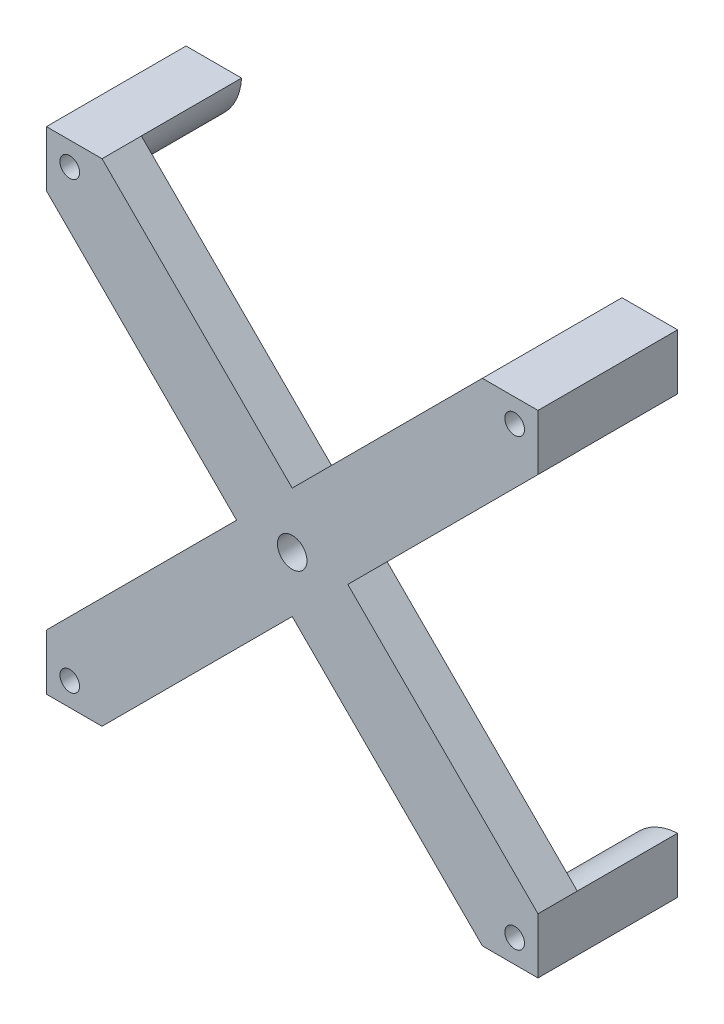
ISO-10303-21;
HEADER;
FILE_DESCRIPTION(('STEP AP214'),'2;1');
FILE_NAME('part.step','',(''),(''),'','','');
FILE_SCHEMA(('AUTOMOTIVE_DESIGN { 1 0 10303 214 1 1 1 1 }'));
ENDSEC;
DATA;
#1=APPLICATION_CONTEXT('core data for automotive mechanical design processes');
#2=APPLICATION_PROTOCOL_DEFINITION('international standard','automotive_design',2000,#1);
#3=PRODUCT_CONTEXT('',#1,'mechanical');
#4=PRODUCT('Part','Part','',(#3));
#5=PRODUCT_RELATED_PRODUCT_CATEGORY('part','',(#4));
#6=PRODUCT_DEFINITION_FORMATION('','',#4);
#7=PRODUCT_DEFINITION_CONTEXT('part definition',#1,'design');
#8=PRODUCT_DEFINITION('design','',#6,#7);
#9=PRODUCT_DEFINITION_SHAPE('','',#8);
#10=(LENGTH_UNIT() NAMED_UNIT(*) SI_UNIT(.MILLI.,.METRE.));
#11=(NAMED_UNIT(*) PLANE_ANGLE_UNIT() SI_UNIT($,.RADIAN.));
#12=(NAMED_UNIT(*) SI_UNIT($,.STERADIAN.) SOLID_ANGLE_UNIT());
#13=UNCERTAINTY_MEASURE_WITH_UNIT(LENGTH_MEASURE(1.E-05),#10,'distance_accuracy_value','');
#14=(GEOMETRIC_REPRESENTATION_CONTEXT(3) GLOBAL_UNCERTAINTY_ASSIGNED_CONTEXT((#13)) GLOBAL_UNIT_ASSIGNED_CONTEXT((#10,
#11,#12)) REPRESENTATION_CONTEXT('',''));
#15=CARTESIAN_POINT('',(0.,0.,0.));
#16=DIRECTION('',(0.,0.,1.));
#17=DIRECTION('',(1.,0.,0.));
#18=AXIS2_PLACEMENT_3D('',#15,#16,#17);
#19=CARTESIAN_POINT('',(0.,0.,0.));
#20=DIRECTION('',(0.,0.,-1.));
#21=DIRECTION('',(-1.,0.,0.));
#22=AXIS2_PLACEMENT_3D('',#19,#20,#21);
#23=PLANE('',#22);
#24=CARTESIAN_POINT('',(0.,0.,0.));
#25=DIRECTION('',(0.,0.,-1.));
#26=DIRECTION('',(-1.,0.,0.));
#27=AXIS2_PLACEMENT_3D('',#24,#25,#26);
#28=CIRCLE('',#27,1.5);
#29=CARTESIAN_POINT('',(-1.5,0.,0.));
#30=VERTEX_POINT('',#29);
#31=EDGE_CURVE('E309',#30,#30,#28,.T.);
#32=ORIENTED_EDGE('',*,*,#31,.F.);
#33=EDGE_LOOP('',(#32));
#34=FACE_BOUND('',#33,.T.);
#35=DIRECTION('',(0.707106781186548,-0.707106781186547,0.));
#36=VECTOR('',#35,1.);
#37=CARTESIAN_POINT('',(2.82842712474619,2.82842712474619,0.));
#38=LINE('',#37,#36);
#39=CARTESIAN_POINT('',(5.65685424949238,0.,0.));
#40=VERTEX_POINT('',#39);
#41=CARTESIAN_POINT('',(25.,-19.3431457505076,0.));
#42=VERTEX_POINT('',#41);
#43=EDGE_CURVE('E294',#40,#42,#38,.T.);
#44=ORIENTED_EDGE('',*,*,#43,.T.);
#45=CARTESIAN_POINT('',(25.3431457505076,-25.333325296557,0.));
#46=DIRECTION('',(0.,0.,-1.));
#47=DIRECTION('',(-1.,0.,0.));
#48=AXIS2_PLACEMENT_3D('',#45,#46,#47);
#49=CIRCLE('',#48,6.);
#50=CARTESIAN_POINT('',(19.352411718131,-25.,0.));
#51=VERTEX_POINT('',#50);
#52=EDGE_CURVE('E267',#42,#51,#49,.F.);
#53=ORIENTED_EDGE('',*,*,#52,.T.);
#54=DIRECTION('',(1.,0.,0.));
#55=VECTOR('',#54,1.);
#56=CARTESIAN_POINT('',(0.,-25.,0.));
#57=LINE('',#56,#55);
#58=CARTESIAN_POINT('',(19.3431457505076,-25.,0.));
#59=VERTEX_POINT('',#58);
#60=EDGE_CURVE('E389',#59,#51,#57,.T.);
#61=ORIENTED_EDGE('',*,*,#60,.F.);
#62=DIRECTION('',(-0.707106781186548,0.707106781186547,0.));
#63=VECTOR('',#62,1.);
#64=CARTESIAN_POINT('',(-2.82842712474619,-2.82842712474619,0.));
#65=LINE('',#64,#63);
#66=CARTESIAN_POINT('',(0.,-5.65685424949238,0.));
#67=VERTEX_POINT('',#66);
#68=EDGE_CURVE('E506',#59,#67,#65,.T.);
#69=ORIENTED_EDGE('',*,*,#68,.T.);
#70=DIRECTION('',(-0.707106781186547,-0.707106781186548,0.));
#71=VECTOR('',#70,1.);
#72=CARTESIAN_POINT('',(2.82842712474619,-2.82842712474619,0.));
#73=LINE('',#72,#71);
#74=CARTESIAN_POINT('',(-19.3431457505076,-25.,0.));
#75=VERTEX_POINT('',#74);
#76=EDGE_CURVE('E502',#67,#75,#73,.T.);
#77=ORIENTED_EDGE('',*,*,#76,.T.);
#78=CARTESIAN_POINT('',(-25.333325296557,-25.3431457505076,0.));
#79=DIRECTION('',(0.,0.,-1.));
#80=DIRECTION('',(-1.,0.,0.));
#81=AXIS2_PLACEMENT_3D('',#78,#79,#80);
#82=CIRCLE('',#81,6.);
#83=CARTESIAN_POINT('',(-25.,-19.352411718131,0.));
#84=VERTEX_POINT('',#83);
#85=EDGE_CURVE('E276',#75,#84,#82,.F.);
#86=ORIENTED_EDGE('',*,*,#85,.T.);
#87=DIRECTION('',(0.,-1.,0.));
#88=VECTOR('',#87,1.);
#89=CARTESIAN_POINT('',(-25.,0.,0.));
#90=LINE('',#89,#88);
#91=CARTESIAN_POINT('',(-25.,-19.3431457505076,0.));
#92=VERTEX_POINT('',#91);
#93=EDGE_CURVE('E398',#92,#84,#90,.T.);
#94=ORIENTED_EDGE('',*,*,#93,.F.);
#95=DIRECTION('',(0.707106781186547,0.707106781186548,0.));
#96=VECTOR('',#95,1.);
#97=CARTESIAN_POINT('',(-2.82842712474619,2.82842712474619,0.));
#98=LINE('',#97,#96);
#99=CARTESIAN_POINT('',(-5.65685424949238,0.,0.));
#100=VERTEX_POINT('',#99);
#101=EDGE_CURVE('E514',#92,#100,#98,.T.);
#102=ORIENTED_EDGE('',*,*,#101,.T.);
#103=DIRECTION('',(-0.707106781186548,0.707106781186547,0.));
#104=VECTOR('',#103,1.);
#105=CARTESIAN_POINT('',(-2.82842712474619,-2.82842712474619,0.));
#106=LINE('',#105,#104);
#107=CARTESIAN_POINT('',(-25.,19.3431457505076,0.));
#108=VERTEX_POINT('',#107);
#109=EDGE_CURVE('E510',#100,#108,#106,.T.);
#110=ORIENTED_EDGE('',*,*,#109,.T.);
#111=CARTESIAN_POINT('',(-25.3431457505076,25.333325296557,0.));
#112=DIRECTION('',(0.,0.,-1.));
#113=DIRECTION('',(-1.,0.,0.));
#114=AXIS2_PLACEMENT_3D('',#111,#112,#113);
#115=CIRCLE('',#114,6.);
#116=CARTESIAN_POINT('',(-19.352411718131,25.,0.));
#117=VERTEX_POINT('',#116);
#118=EDGE_CURVE('E12',#108,#117,#115,.F.);
#119=ORIENTED_EDGE('',*,*,#118,.T.);
#120=DIRECTION('',(-1.,0.,0.));
#121=VECTOR('',#120,1.);
#122=CARTESIAN_POINT('',(0.,25.,0.));
#123=LINE('',#122,#121);
#124=CARTESIAN_POINT('',(-19.3431457505076,25.,0.));
#125=VERTEX_POINT('',#124);
#126=EDGE_CURVE('E132',#125,#117,#123,.T.);
#127=ORIENTED_EDGE('',*,*,#126,.F.);
#128=DIRECTION('',(0.707106781186548,-0.707106781186547,0.));
#129=VECTOR('',#128,1.);
#130=CARTESIAN_POINT('',(2.82842712474619,2.82842712474619,0.));
#131=LINE('',#130,#129);
#132=CARTESIAN_POINT('',(0.,5.65685424949238,0.));
#133=VERTEX_POINT('',#132);
#134=EDGE_CURVE('E305',#125,#133,#131,.T.);
#135=ORIENTED_EDGE('',*,*,#134,.T.);
#136=DIRECTION('',(0.707106781186547,0.707106781186548,0.));
#137=VECTOR('',#136,1.);
#138=CARTESIAN_POINT('',(-2.82842712474619,2.82842712474619,0.));
#139=LINE('',#138,#137);
#140=CARTESIAN_POINT('',(19.3431457505076,25.,0.));
#141=VERTEX_POINT('',#140);
#142=EDGE_CURVE('E311',#133,#141,#139,.T.);
#143=ORIENTED_EDGE('',*,*,#142,.T.);
#144=CARTESIAN_POINT('',(25.333325296557,25.3431457505076,0.));
#145=DIRECTION('',(0.,0.,-1.));
#146=DIRECTION('',(-1.,0.,0.));
#147=AXIS2_PLACEMENT_3D('',#144,#145,#146);
#148=CIRCLE('',#147,6.);
#149=CARTESIAN_POINT('',(25.,19.352411718131,0.));
#150=VERTEX_POINT('',#149);
#151=EDGE_CURVE('E126',#141,#150,#148,.F.);
#152=ORIENTED_EDGE('',*,*,#151,.T.);
#153=DIRECTION('',(0.,1.,0.));
#154=VECTOR('',#153,1.);
#155=CARTESIAN_POINT('',(25.,0.,0.));
#156=LINE('',#155,#154);
#157=CARTESIAN_POINT('',(25.,19.3431457505076,0.));
#158=VERTEX_POINT('',#157);
#159=EDGE_CURVE('E139',#158,#150,#156,.T.);
#160=ORIENTED_EDGE('',*,*,#159,.F.);
#161=DIRECTION('',(-0.707106781186547,-0.707106781186548,0.));
#162=VECTOR('',#161,1.);
#163=CARTESIAN_POINT('',(2.82842712474619,-2.82842712474619,0.));
#164=LINE('',#163,#162);
#165=EDGE_CURVE('E303',#158,#40,#164,.T.);
#166=ORIENTED_EDGE('',*,*,#165,.T.);
#167=EDGE_LOOP('',(#44,#53,#61,#69,#77,#86,#94,#102,#110,#119,#127,#135,#143,#152,#160,#166));
#168=FACE_BOUND('',#167,.T.);
#169=ADVANCED_FACE('F117',(#34,#168),#23,.T.);
#170=CARTESIAN_POINT('',(0.,0.,4.));
#171=DIRECTION('',(0.,0.,-1.));
#172=DIRECTION('',(-1.,0.,0.));
#173=AXIS2_PLACEMENT_3D('',#170,#171,#172);
#174=PLANE('',#173);
#175=CARTESIAN_POINT('',(-22.6274169979695,22.6274169979695,4.));
#176=DIRECTION('',(0.,0.,1.));
#177=DIRECTION('',(1.,0.,0.));
#178=AXIS2_PLACEMENT_3D('',#175,#176,#177);
#179=CIRCLE('',#178,0.999999999999998);
#180=CARTESIAN_POINT('',(-21.6274169979695,22.6274169979695,4.));
#181=VERTEX_POINT('',#180);
#182=EDGE_CURVE('E327',#181,#181,#179,.T.);
#183=ORIENTED_EDGE('',*,*,#182,.F.);
#184=EDGE_LOOP('',(#183));
#185=FACE_BOUND('',#184,.T.);
#186=CARTESIAN_POINT('',(22.6274169979695,22.6274169979695,4.));
#187=DIRECTION('',(0.,0.,1.));
#188=DIRECTION('',(1.,0.,0.));
#189=AXIS2_PLACEMENT_3D('',#186,#187,#188);
#190=CIRCLE('',#189,0.999999999999998);
#191=CARTESIAN_POINT('',(23.6274169979695,22.6274169979695,4.));
#192=VERTEX_POINT('',#191);
#193=EDGE_CURVE('E323',#192,#192,#190,.T.);
#194=ORIENTED_EDGE('',*,*,#193,.F.);
#195=EDGE_LOOP('',(#194));
#196=FACE_BOUND('',#195,.T.);
#197=CARTESIAN_POINT('',(22.6274169979695,-22.6274169979695,4.));
#198=DIRECTION('',(0.,0.,1.));
#199=DIRECTION('',(1.,0.,0.));
#200=AXIS2_PLACEMENT_3D('',#197,#198,#199);
#201=CIRCLE('',#200,0.999999999999998);
#202=CARTESIAN_POINT('',(23.6274169979695,-22.6274169979695,4.));
#203=VERTEX_POINT('',#202);
#204=EDGE_CURVE('E319',#203,#203,#201,.T.);
#205=ORIENTED_EDGE('',*,*,#204,.F.);
#206=EDGE_LOOP('',(#205));
#207=FACE_BOUND('',#206,.T.);
#208=CARTESIAN_POINT('',(-22.6274169979695,-22.6274169979695,4.));
#209=DIRECTION('',(0.,0.,1.));
#210=DIRECTION('',(1.,0.,0.));
#211=AXIS2_PLACEMENT_3D('',#208,#209,#210);
#212=CIRCLE('',#211,0.999999999999998);
#213=CARTESIAN_POINT('',(-21.6274169979695,-22.6274169979695,4.));
#214=VERTEX_POINT('',#213);
#215=EDGE_CURVE('E315',#214,#214,#212,.T.);
#216=ORIENTED_EDGE('',*,*,#215,.F.);
#217=EDGE_LOOP('',(#216));
#218=FACE_BOUND('',#217,.T.);
#219=CARTESIAN_POINT('',(0.,0.,4.));
#220=DIRECTION('',(0.,0.,1.));
#221=DIRECTION('',(1.,0.,0.));
#222=AXIS2_PLACEMENT_3D('',#219,#220,#221);
#223=CIRCLE('',#222,1.5);
#224=CARTESIAN_POINT('',(1.5,0.,4.));
#225=VERTEX_POINT('',#224);
#226=EDGE_CURVE('E451',#225,#225,#223,.T.);
#227=ORIENTED_EDGE('',*,*,#226,.F.);
#228=EDGE_LOOP('',(#227));
#229=FACE_BOUND('',#228,.T.);
#230=DIRECTION('',(0.707106781186547,0.707106781186548,0.));
#231=VECTOR('',#230,1.);
#232=CARTESIAN_POINT('',(2.82842712474619,-2.82842712474619,4.));
#233=LINE('',#232,#231);
#234=CARTESIAN_POINT('',(5.65685424949238,0.,4.));
#235=VERTEX_POINT('',#234);
#236=CARTESIAN_POINT('',(25.,19.3431457505076,4.));
#237=VERTEX_POINT('',#236);
#238=EDGE_CURVE('E468',#235,#237,#233,.T.);
#239=ORIENTED_EDGE('',*,*,#238,.T.);
#240=DIRECTION('',(0.,1.,0.));
#241=VECTOR('',#240,1.);
#242=CARTESIAN_POINT('',(25.,-25.,4.));
#243=LINE('',#242,#241);
#244=CARTESIAN_POINT('',(25.,25.,4.));
#245=VERTEX_POINT('',#244);
#246=EDGE_CURVE('E331',#237,#245,#243,.T.);
#247=ORIENTED_EDGE('',*,*,#246,.T.);
#248=DIRECTION('',(-1.,0.,0.));
#249=VECTOR('',#248,1.);
#250=CARTESIAN_POINT('',(-25.,25.,4.));
#251=LINE('',#250,#249);
#252=CARTESIAN_POINT('',(19.3431457505076,25.,4.));
#253=VERTEX_POINT('',#252);
#254=EDGE_CURVE('E336',#245,#253,#251,.T.);
#255=ORIENTED_EDGE('',*,*,#254,.T.);
#256=DIRECTION('',(-0.707106781186547,-0.707106781186548,0.));
#257=VECTOR('',#256,1.);
#258=CARTESIAN_POINT('',(-2.82842712474619,2.82842712474619,4.));
#259=LINE('',#258,#257);
#260=CARTESIAN_POINT('',(0.,5.65685424949238,4.));
#261=VERTEX_POINT('',#260);
#262=EDGE_CURVE('E484',#253,#261,#259,.T.);
#263=ORIENTED_EDGE('',*,*,#262,.T.);
#264=DIRECTION('',(-0.707106781186548,0.707106781186547,0.));
#265=VECTOR('',#264,1.);
#266=CARTESIAN_POINT('',(2.82842712474619,2.82842712474619,4.));
#267=LINE('',#266,#265);
#268=CARTESIAN_POINT('',(-19.3431457505076,25.,4.));
#269=VERTEX_POINT('',#268);
#270=EDGE_CURVE('E480',#261,#269,#267,.T.);
#271=ORIENTED_EDGE('',*,*,#270,.T.);
#272=CARTESIAN_POINT('',(-25.,25.,4.));
#273=VERTEX_POINT('',#272);
#274=EDGE_CURVE('E335',#269,#273,#251,.T.);
#275=ORIENTED_EDGE('',*,*,#274,.T.);
#276=DIRECTION('',(0.,-1.,0.));
#277=VECTOR('',#276,1.);
#278=CARTESIAN_POINT('',(-25.,-25.,4.));
#279=LINE('',#278,#277);
#280=CARTESIAN_POINT('',(-25.,19.3431457505076,4.));
#281=VERTEX_POINT('',#280);
#282=EDGE_CURVE('E341',#273,#281,#279,.T.);
#283=ORIENTED_EDGE('',*,*,#282,.T.);
#284=DIRECTION('',(0.707106781186548,-0.707106781186547,0.));
#285=VECTOR('',#284,1.);
#286=CARTESIAN_POINT('',(-2.82842712474619,-2.82842712474619,4.));
#287=LINE('',#286,#285);
#288=CARTESIAN_POINT('',(-5.65685424949238,0.,4.));
#289=VERTEX_POINT('',#288);
#290=EDGE_CURVE('E495',#281,#289,#287,.T.);
#291=ORIENTED_EDGE('',*,*,#290,.T.);
#292=DIRECTION('',(-0.707106781186547,-0.707106781186548,0.));
#293=VECTOR('',#292,1.);
#294=CARTESIAN_POINT('',(-2.82842712474619,2.82842712474619,4.));
#295=LINE('',#294,#293);
#296=CARTESIAN_POINT('',(-25.,-19.3431457505076,4.));
#297=VERTEX_POINT('',#296);
#298=EDGE_CURVE('E491',#289,#297,#295,.T.);
#299=ORIENTED_EDGE('',*,*,#298,.T.);
#300=CARTESIAN_POINT('',(-25.,-25.,4.));
#301=VERTEX_POINT('',#300);
#302=EDGE_CURVE('E340',#297,#301,#279,.T.);
#303=ORIENTED_EDGE('',*,*,#302,.T.);
#304=DIRECTION('',(1.,0.,0.));
#305=VECTOR('',#304,1.);
#306=CARTESIAN_POINT('',(-25.,-25.,4.));
#307=LINE('',#306,#305);
#308=CARTESIAN_POINT('',(-19.3431457505076,-25.,4.));
#309=VERTEX_POINT('',#308);
#310=EDGE_CURVE('E346',#301,#309,#307,.T.);
#311=ORIENTED_EDGE('',*,*,#310,.T.);
#312=DIRECTION('',(0.707106781186547,0.707106781186548,0.));
#313=VECTOR('',#312,1.);
#314=CARTESIAN_POINT('',(2.82842712474619,-2.82842712474619,4.));
#315=LINE('',#314,#313);
#316=CARTESIAN_POINT('',(0.,-5.65685424949238,4.));
#317=VERTEX_POINT('',#316);
#318=EDGE_CURVE('E461',#309,#317,#315,.T.);
#319=ORIENTED_EDGE('',*,*,#318,.T.);
#320=DIRECTION('',(0.707106781186548,-0.707106781186547,0.));
#321=VECTOR('',#320,1.);
#322=CARTESIAN_POINT('',(-2.82842712474619,-2.82842712474619,4.));
#323=LINE('',#322,#321);
#324=CARTESIAN_POINT('',(19.3431457505076,-25.,4.));
#325=VERTEX_POINT('',#324);
#326=EDGE_CURVE('E457',#317,#325,#323,.T.);
#327=ORIENTED_EDGE('',*,*,#326,.T.);
#328=CARTESIAN_POINT('',(25.,-25.,4.));
#329=VERTEX_POINT('',#328);
#330=EDGE_CURVE('E345',#325,#329,#307,.T.);
#331=ORIENTED_EDGE('',*,*,#330,.T.);
#332=CARTESIAN_POINT('',(25.,-19.3431457505076,4.));
#333=VERTEX_POINT('',#332);
#334=EDGE_CURVE('E332',#329,#333,#243,.T.);
#335=ORIENTED_EDGE('',*,*,#334,.T.);
#336=DIRECTION('',(-0.707106781186548,0.707106781186547,0.));
#337=VECTOR('',#336,1.);
#338=CARTESIAN_POINT('',(2.82842712474619,2.82842712474619,4.));
#339=LINE('',#338,#337);
#340=EDGE_CURVE('E297',#333,#235,#339,.T.);
#341=ORIENTED_EDGE('',*,*,#340,.T.);
#342=EDGE_LOOP('',(#239,#247,#255,#263,#271,#275,#283,#291,#299,#303,#311,#319,#327,#331,#335,#341));
#343=FACE_BOUND('',#342,.T.);
#344=ADVANCED_FACE('F535',(#185,#196,#207,#218,#229,#343),#174,.F.);
#345=CARTESIAN_POINT('',(25.,-25.,4.));
#346=DIRECTION('',(-1.,0.,0.));
#347=DIRECTION('',(0.,0.,1.));
#348=AXIS2_PLACEMENT_3D('',#345,#346,#347);
#349=PLANE('',#348);
#350=DIRECTION('',(0.,0.,1.));
#351=VECTOR('',#350,1.);
#352=CARTESIAN_POINT('',(25.,19.3431457505076,4.));
#353=LINE('',#352,#351);
#354=EDGE_CURVE('E299',#158,#237,#353,.T.);
#355=ORIENTED_EDGE('',*,*,#354,.F.);
#356=ORIENTED_EDGE('',*,*,#159,.T.);
#357=DIRECTION('',(0.,0.,-1.));
#358=VECTOR('',#357,1.);
#359=CARTESIAN_POINT('',(25.,19.352411718131,-5.1));
#360=LINE('',#359,#358);
#361=CARTESIAN_POINT('',(25.,19.352411718131,-10.2));
#362=VERTEX_POINT('',#361);
#363=EDGE_CURVE('E405',#150,#362,#360,.T.);
#364=ORIENTED_EDGE('',*,*,#363,.T.);
#365=DIRECTION('',(0.,-1.,0.));
#366=VECTOR('',#365,1.);
#367=CARTESIAN_POINT('',(25.,25.,-10.2));
#368=LINE('',#367,#366);
#369=CARTESIAN_POINT('',(25.,25.,-10.2));
#370=VERTEX_POINT('',#369);
#371=EDGE_CURVE('E441',#370,#362,#368,.T.);
#372=ORIENTED_EDGE('',*,*,#371,.F.);
#373=DIRECTION('',(0.,0.,-1.));
#374=VECTOR('',#373,1.);
#375=CARTESIAN_POINT('',(25.,25.,4.));
#376=LINE('',#375,#374);
#377=EDGE_CURVE('E359',#245,#370,#376,.T.);
#378=ORIENTED_EDGE('',*,*,#377,.F.);
#379=ORIENTED_EDGE('',*,*,#246,.F.);
#380=EDGE_LOOP('',(#355,#356,#364,#372,#378,#379));
#381=FACE_BOUND('',#380,.T.);
#382=ADVANCED_FACE('F428',(#381),#349,.F.);
#383=DIRECTION('',(0.,0.,-1.));
#384=VECTOR('',#383,1.);
#385=CARTESIAN_POINT('',(25.,-19.3431457505076,4.));
#386=LINE('',#385,#384);
#387=EDGE_CURVE('E285',#333,#42,#386,.T.);
#388=ORIENTED_EDGE('',*,*,#387,.F.);
#389=ORIENTED_EDGE('',*,*,#334,.F.);
#390=DIRECTION('',(0.,0.,-1.));
#391=VECTOR('',#390,1.);
#392=CARTESIAN_POINT('',(25.,-25.,4.));
#393=LINE('',#392,#391);
#394=CARTESIAN_POINT('',(25.,-25.,-10.2));
#395=VERTEX_POINT('',#394);
#396=EDGE_CURVE('E350',#329,#395,#393,.T.);
#397=ORIENTED_EDGE('',*,*,#396,.T.);
#398=DIRECTION('',(0.,-1.,0.));
#399=VECTOR('',#398,1.);
#400=CARTESIAN_POINT('',(25.,-25.,-10.2));
#401=LINE('',#400,#399);
#402=CARTESIAN_POINT('',(25.,-19.3431457505076,-10.2));
#403=VERTEX_POINT('',#402);
#404=EDGE_CURVE('E288',#403,#395,#401,.T.);
#405=ORIENTED_EDGE('',*,*,#404,.F.);
#406=DIRECTION('',(0.,0.,1.));
#407=VECTOR('',#406,1.);
#408=CARTESIAN_POINT('',(25.,-19.3431457505076,-10.2));
#409=LINE('',#408,#407);
#410=EDGE_CURVE('E271',#403,#42,#409,.T.);
#411=ORIENTED_EDGE('',*,*,#410,.T.);
#412=EDGE_LOOP('',(#388,#389,#397,#405,#411));
#413=FACE_BOUND('',#412,.T.);
#414=ADVANCED_FACE('F283',(#413),#349,.F.);
#415=CARTESIAN_POINT('',(-25.,25.,4.));
#416=DIRECTION('',(0.,-1.,0.));
#417=DIRECTION('',(0.,0.,-1.));
#418=AXIS2_PLACEMENT_3D('',#415,#416,#417);
#419=PLANE('',#418);
#420=DIRECTION('',(0.,0.,1.));
#421=VECTOR('',#420,1.);
#422=CARTESIAN_POINT('',(-19.3431457505076,25.,4.));
#423=LINE('',#422,#421);
#424=EDGE_CURVE('E300',#125,#269,#423,.T.);
#425=ORIENTED_EDGE('',*,*,#424,.F.);
#426=ORIENTED_EDGE('',*,*,#126,.T.);
#427=DIRECTION('',(0.,0.,-1.));
#428=VECTOR('',#427,1.);
#429=CARTESIAN_POINT('',(-19.352411718131,25.,-5.1));
#430=LINE('',#429,#428);
#431=CARTESIAN_POINT('',(-19.352411718131,25.,-10.2));
#432=VERTEX_POINT('',#431);
#433=EDGE_CURVE('E413',#117,#432,#430,.T.);
#434=ORIENTED_EDGE('',*,*,#433,.T.);
#435=DIRECTION('',(1.,0.,0.));
#436=VECTOR('',#435,1.);
#437=CARTESIAN_POINT('',(-25.,25.,-10.2));
#438=LINE('',#437,#436);
#439=CARTESIAN_POINT('',(-25.,25.,-10.2));
#440=VERTEX_POINT('',#439);
#441=EDGE_CURVE('E544',#440,#432,#438,.T.);
#442=ORIENTED_EDGE('',*,*,#441,.F.);
#443=DIRECTION('',(0.,0.,-1.));
#444=VECTOR('',#443,1.);
#445=CARTESIAN_POINT('',(-25.,25.,4.));
#446=LINE('',#445,#444);
#447=EDGE_CURVE('E356',#273,#440,#446,.T.);
#448=ORIENTED_EDGE('',*,*,#447,.F.);
#449=ORIENTED_EDGE('',*,*,#274,.F.);
#450=EDGE_LOOP('',(#425,#426,#434,#442,#448,#449));
#451=FACE_BOUND('',#450,.T.);
#452=ADVANCED_FACE('F542',(#451),#419,.F.);
#453=DIRECTION('',(0.,0.,-1.));
#454=VECTOR('',#453,1.);
#455=CARTESIAN_POINT('',(19.3431457505076,25.,4.));
#456=LINE('',#455,#454);
#457=EDGE_CURVE('E376',#253,#141,#456,.T.);
#458=ORIENTED_EDGE('',*,*,#457,.F.);
#459=ORIENTED_EDGE('',*,*,#254,.F.);
#460=ORIENTED_EDGE('',*,*,#377,.T.);
#461=DIRECTION('',(1.,0.,0.));
#462=VECTOR('',#461,1.);
#463=CARTESIAN_POINT('',(25.,25.,-10.2));
#464=LINE('',#463,#462);
#465=CARTESIAN_POINT('',(19.3431457505076,25.,-10.2));
#466=VERTEX_POINT('',#465);
#467=EDGE_CURVE('E440',#466,#370,#464,.T.);
#468=ORIENTED_EDGE('',*,*,#467,.F.);
#469=DIRECTION('',(0.,0.,1.));
#470=VECTOR('',#469,1.);
#471=CARTESIAN_POINT('',(19.3431457505076,25.,-10.2));
#472=LINE('',#471,#470);
#473=EDGE_CURVE('E434',#466,#141,#472,.T.);
#474=ORIENTED_EDGE('',*,*,#473,.T.);
#475=EDGE_LOOP('',(#458,#459,#460,#468,#474));
#476=FACE_BOUND('',#475,.T.);
#477=ADVANCED_FACE('F444',(#476),#419,.F.);
#478=CARTESIAN_POINT('',(-25.,-25.,4.));
#479=DIRECTION('',(1.,0.,0.));
#480=DIRECTION('',(0.,0.,-1.));
#481=AXIS2_PLACEMENT_3D('',#478,#479,#480);
#482=PLANE('',#481);
#483=DIRECTION('',(0.,0.,1.));
#484=VECTOR('',#483,1.);
#485=CARTESIAN_POINT('',(-25.,-19.3431457505076,4.));
#486=LINE('',#485,#484);
#487=EDGE_CURVE('E373',#92,#297,#486,.T.);
#488=ORIENTED_EDGE('',*,*,#487,.F.);
#489=ORIENTED_EDGE('',*,*,#93,.T.);
#490=DIRECTION('',(0.,0.,-1.));
#491=VECTOR('',#490,1.);
#492=CARTESIAN_POINT('',(-25.,-19.352411718131,-5.1));
#493=LINE('',#492,#491);
#494=CARTESIAN_POINT('',(-25.,-19.352411718131,-10.2));
#495=VERTEX_POINT('',#494);
#496=EDGE_CURVE('E395',#84,#495,#493,.T.);
#497=ORIENTED_EDGE('',*,*,#496,.T.);
#498=DIRECTION('',(0.,1.,0.));
#499=VECTOR('',#498,1.);
#500=CARTESIAN_POINT('',(-25.,-25.,-10.2));
#501=LINE('',#500,#499);
#502=CARTESIAN_POINT('',(-25.,-25.,-10.2));
#503=VERTEX_POINT('',#502);
#504=EDGE_CURVE('E912',#503,#495,#501,.T.);
#505=ORIENTED_EDGE('',*,*,#504,.F.);
#506=DIRECTION('',(0.,0.,-1.));
#507=VECTOR('',#506,1.);
#508=CARTESIAN_POINT('',(-25.,-25.,4.));
#509=LINE('',#508,#507);
#510=EDGE_CURVE('E353',#301,#503,#509,.T.);
#511=ORIENTED_EDGE('',*,*,#510,.F.);
#512=ORIENTED_EDGE('',*,*,#302,.F.);
#513=EDGE_LOOP('',(#488,#489,#497,#505,#511,#512));
#514=FACE_BOUND('',#513,.T.);
#515=ADVANCED_FACE('F604',(#514),#482,.F.);
#516=DIRECTION('',(0.,0.,-1.));
#517=VECTOR('',#516,1.);
#518=CARTESIAN_POINT('',(-25.,19.3431457505076,4.));
#519=LINE('',#518,#517);
#520=EDGE_CURVE('E369',#281,#108,#519,.T.);
#521=ORIENTED_EDGE('',*,*,#520,.F.);
#522=ORIENTED_EDGE('',*,*,#282,.F.);
#523=ORIENTED_EDGE('',*,*,#447,.T.);
#524=DIRECTION('',(0.,1.,0.));
#525=VECTOR('',#524,1.);
#526=CARTESIAN_POINT('',(-25.,25.,-10.2));
#527=LINE('',#526,#525);
#528=CARTESIAN_POINT('',(-25.,19.3431457505076,-10.2));
#529=VERTEX_POINT('',#528);
#530=EDGE_CURVE('E546',#529,#440,#527,.T.);
#531=ORIENTED_EDGE('',*,*,#530,.F.);
#532=DIRECTION('',(0.,0.,1.));
#533=VECTOR('',#532,1.);
#534=CARTESIAN_POINT('',(-25.,19.3431457505076,-10.2));
#535=LINE('',#534,#533);
#536=EDGE_CURVE('E533',#529,#108,#535,.T.);
#537=ORIENTED_EDGE('',*,*,#536,.T.);
#538=EDGE_LOOP('',(#521,#522,#523,#531,#537));
#539=FACE_BOUND('',#538,.T.);
#540=ADVANCED_FACE('F530',(#539),#482,.F.);
#541=CARTESIAN_POINT('',(-25.,-25.,4.));
#542=DIRECTION('',(0.,1.,0.));
#543=DIRECTION('',(0.,0.,1.));
#544=AXIS2_PLACEMENT_3D('',#541,#542,#543);
#545=PLANE('',#544);
#546=DIRECTION('',(0.,0.,1.));
#547=VECTOR('',#546,1.);
#548=CARTESIAN_POINT('',(19.3431457505076,-25.,4.));
#549=LINE('',#548,#547);
#550=EDGE_CURVE('E366',#59,#325,#549,.T.);
#551=ORIENTED_EDGE('',*,*,#550,.F.);
#552=ORIENTED_EDGE('',*,*,#60,.T.);
#553=DIRECTION('',(0.,0.,-1.));
#554=VECTOR('',#553,1.);
#555=CARTESIAN_POINT('',(19.352411718131,-25.,-5.1));
#556=LINE('',#555,#554);
#557=CARTESIAN_POINT('',(19.352411718131,-25.,-10.2));
#558=VERTEX_POINT('',#557);
#559=EDGE_CURVE('E272',#51,#558,#556,.T.);
#560=ORIENTED_EDGE('',*,*,#559,.T.);
#561=DIRECTION('',(-1.,0.,0.));
#562=VECTOR('',#561,1.);
#563=CARTESIAN_POINT('',(25.,-25.,-10.2));
#564=LINE('',#563,#562);
#565=EDGE_CURVE('E290',#395,#558,#564,.T.);
#566=ORIENTED_EDGE('',*,*,#565,.F.);
#567=ORIENTED_EDGE('',*,*,#396,.F.);
#568=ORIENTED_EDGE('',*,*,#330,.F.);
#569=EDGE_LOOP('',(#551,#552,#560,#566,#567,#568));
#570=FACE_BOUND('',#569,.T.);
#571=ADVANCED_FACE('F599',(#570),#545,.F.);
#572=DIRECTION('',(0.,0.,-1.));
#573=VECTOR('',#572,1.);
#574=CARTESIAN_POINT('',(-19.3431457505076,-25.,4.));
#575=LINE('',#574,#573);
#576=EDGE_CURVE('E362',#309,#75,#575,.T.);
#577=ORIENTED_EDGE('',*,*,#576,.F.);
#578=ORIENTED_EDGE('',*,*,#310,.F.);
#579=ORIENTED_EDGE('',*,*,#510,.T.);
#580=DIRECTION('',(-1.,0.,0.));
#581=VECTOR('',#580,1.);
#582=CARTESIAN_POINT('',(-25.,-25.,-10.2));
#583=LINE('',#582,#581);
#584=CARTESIAN_POINT('',(-19.3431457505076,-25.,-10.2));
#585=VERTEX_POINT('',#584);
#586=EDGE_CURVE('E561',#585,#503,#583,.T.);
#587=ORIENTED_EDGE('',*,*,#586,.F.);
#588=DIRECTION('',(0.,0.,1.));
#589=VECTOR('',#588,1.);
#590=CARTESIAN_POINT('',(-19.3431457505076,-25.,-10.2));
#591=LINE('',#590,#589);
#592=EDGE_CURVE('E906',#585,#75,#591,.T.);
#593=ORIENTED_EDGE('',*,*,#592,.T.);
#594=EDGE_LOOP('',(#577,#578,#579,#587,#593));
#595=FACE_BOUND('',#594,.T.);
#596=ADVANCED_FACE('F602',(#595),#545,.F.);
#597=CARTESIAN_POINT('',(-22.6274169979695,22.6274169979695,4.));
#598=DIRECTION('',(0.,0.,-1.));
#599=DIRECTION('',(-1.,0.,0.));
#600=AXIS2_PLACEMENT_3D('',#597,#598,#599);
#601=CYLINDRICAL_SURFACE('',#600,0.999999999999998);
#602=ORIENTED_EDGE('',*,*,#182,.T.);
#603=EDGE_LOOP('',(#602));
#604=FACE_BOUND('',#603,.T.);
#605=CARTESIAN_POINT('',(-22.6274169979695,22.6274169979695,-10.2));
#606=DIRECTION('',(0.,0.,-1.));
#607=DIRECTION('',(-1.,0.,0.));
#608=AXIS2_PLACEMENT_3D('',#605,#606,#607);
#609=CIRCLE('',#608,0.999999999999998);
#610=CARTESIAN_POINT('',(-23.6274169979695,22.6274169979695,-10.2));
#611=VERTEX_POINT('',#610);
#612=EDGE_CURVE('E549',#611,#611,#609,.T.);
#613=ORIENTED_EDGE('',*,*,#612,.T.);
#614=EDGE_LOOP('',(#613));
#615=FACE_BOUND('',#614,.T.);
#616=ADVANCED_FACE('F704',(#604,#615),#601,.F.);
#617=CARTESIAN_POINT('',(22.6274169979695,22.6274169979695,4.));
#618=DIRECTION('',(0.,0.,-1.));
#619=DIRECTION('',(-1.,0.,0.));
#620=AXIS2_PLACEMENT_3D('',#617,#618,#619);
#621=CYLINDRICAL_SURFACE('',#620,0.999999999999998);
#622=ORIENTED_EDGE('',*,*,#193,.T.);
#623=EDGE_LOOP('',(#622));
#624=FACE_BOUND('',#623,.T.);
#625=CARTESIAN_POINT('',(22.6274169979695,22.6274169979695,-10.2));
#626=DIRECTION('',(0.,0.,-1.));
#627=DIRECTION('',(-1.,0.,0.));
#628=AXIS2_PLACEMENT_3D('',#625,#626,#627);
#629=CIRCLE('',#628,1.00000000000001);
#630=CARTESIAN_POINT('',(21.6274169979695,22.6274169979695,-10.2));
#631=VERTEX_POINT('',#630);
#632=EDGE_CURVE('E453',#631,#631,#629,.T.);
#633=ORIENTED_EDGE('',*,*,#632,.T.);
#634=EDGE_LOOP('',(#633));
#635=FACE_BOUND('',#634,.T.);
#636=ADVANCED_FACE('F571',(#624,#635),#621,.F.);
#637=CARTESIAN_POINT('',(22.6274169979695,-22.6274169979695,4.));
#638=DIRECTION('',(0.,0.,-1.));
#639=DIRECTION('',(-1.,0.,0.));
#640=AXIS2_PLACEMENT_3D('',#637,#638,#639);
#641=CYLINDRICAL_SURFACE('',#640,0.999999999999998);
#642=ORIENTED_EDGE('',*,*,#204,.T.);
#643=EDGE_LOOP('',(#642));
#644=FACE_BOUND('',#643,.T.);
#645=CARTESIAN_POINT('',(22.6274169979695,-22.6274169979695,-10.2));
#646=DIRECTION('',(0.,0.,-1.));
#647=DIRECTION('',(-1.,0.,0.));
#648=AXIS2_PLACEMENT_3D('',#645,#646,#647);
#649=CIRCLE('',#648,0.999999999999998);
#650=CARTESIAN_POINT('',(21.6274169979695,-22.6274169979695,-10.2));
#651=VERTEX_POINT('',#650);
#652=EDGE_CURVE('E902',#651,#651,#649,.T.);
#653=ORIENTED_EDGE('',*,*,#652,.T.);
#654=EDGE_LOOP('',(#653));
#655=FACE_BOUND('',#654,.T.);
#656=ADVANCED_FACE('F679',(#644,#655),#641,.F.);
#657=CARTESIAN_POINT('',(-22.6274169979695,-22.6274169979695,4.));
#658=DIRECTION('',(0.,0.,-1.));
#659=DIRECTION('',(-1.,0.,0.));
#660=AXIS2_PLACEMENT_3D('',#657,#658,#659);
#661=CYLINDRICAL_SURFACE('',#660,0.999999999999998);
#662=ORIENTED_EDGE('',*,*,#215,.T.);
#663=EDGE_LOOP('',(#662));
#664=FACE_BOUND('',#663,.T.);
#665=CARTESIAN_POINT('',(-22.6274169979695,-22.6274169979695,-10.2));
#666=DIRECTION('',(0.,0.,-1.));
#667=DIRECTION('',(-1.,0.,0.));
#668=AXIS2_PLACEMENT_3D('',#665,#666,#667);
#669=CIRCLE('',#668,0.999999999999998);
#670=CARTESIAN_POINT('',(-23.6274169979695,-22.6274169979695,-10.2));
#671=VERTEX_POINT('',#670);
#672=EDGE_CURVE('E555',#671,#671,#669,.T.);
#673=ORIENTED_EDGE('',*,*,#672,.T.);
#674=EDGE_LOOP('',(#673));
#675=FACE_BOUND('',#674,.T.);
#676=ADVANCED_FACE('F672',(#664,#675),#661,.F.);
#677=CARTESIAN_POINT('',(-2.82842712474619,-2.82842712474619,-6.));
#678=DIRECTION('',(-0.707106781186547,-0.707106781186548,0.));
#679=DIRECTION('',(0.707106781186548,-0.707106781186547,0.));
#680=AXIS2_PLACEMENT_3D('',#677,#678,#679);
#681=PLANE('',#680);
#682=ORIENTED_EDGE('',*,*,#550,.T.);
#683=ORIENTED_EDGE('',*,*,#326,.F.);
#684=DIRECTION('',(0.,0.,1.));
#685=VECTOR('',#684,1.);
#686=CARTESIAN_POINT('',(0.,-5.65685424949238,-6.));
#687=LINE('',#686,#685);
#688=EDGE_CURVE('E465',#67,#317,#687,.T.);
#689=ORIENTED_EDGE('',*,*,#688,.F.);
#690=ORIENTED_EDGE('',*,*,#68,.F.);
#691=EDGE_LOOP('',(#682,#683,#689,#690));
#692=FACE_BOUND('',#691,.T.);
#693=ADVANCED_FACE('F678',(#692),#681,.T.);
#694=CARTESIAN_POINT('',(2.82842712474619,-2.82842712474619,-6.));
#695=DIRECTION('',(0.707106781186548,-0.707106781186547,0.));
#696=DIRECTION('',(0.707106781186547,0.707106781186548,0.));
#697=AXIS2_PLACEMENT_3D('',#694,#695,#696);
#698=PLANE('',#697);
#699=ORIENTED_EDGE('',*,*,#688,.T.);
#700=ORIENTED_EDGE('',*,*,#318,.F.);
#701=ORIENTED_EDGE('',*,*,#576,.T.);
#702=ORIENTED_EDGE('',*,*,#76,.F.);
#703=EDGE_LOOP('',(#699,#700,#701,#702));
#704=FACE_BOUND('',#703,.T.);
#705=ADVANCED_FACE('F842',(#704),#698,.T.);
#706=CARTESIAN_POINT('',(-2.82842712474619,2.82842712474619,-6.));
#707=DIRECTION('',(-0.707106781186548,0.707106781186547,0.));
#708=DIRECTION('',(-0.707106781186547,-0.707106781186548,0.));
#709=AXIS2_PLACEMENT_3D('',#706,#707,#708);
#710=PLANE('',#709);
#711=ORIENTED_EDGE('',*,*,#487,.T.);
#712=ORIENTED_EDGE('',*,*,#298,.F.);
#713=DIRECTION('',(0.,0.,1.));
#714=VECTOR('',#713,1.);
#715=CARTESIAN_POINT('',(-5.65685424949238,0.,-6.));
#716=LINE('',#715,#714);
#717=EDGE_CURVE('E499',#100,#289,#716,.T.);
#718=ORIENTED_EDGE('',*,*,#717,.F.);
#719=ORIENTED_EDGE('',*,*,#101,.F.);
#720=EDGE_LOOP('',(#711,#712,#718,#719));
#721=FACE_BOUND('',#720,.T.);
#722=ADVANCED_FACE('F522',(#721),#710,.T.);
#723=CARTESIAN_POINT('',(-2.82842712474619,-2.82842712474619,-6.));
#724=DIRECTION('',(-0.707106781186547,-0.707106781186548,0.));
#725=DIRECTION('',(0.707106781186548,-0.707106781186547,0.));
#726=AXIS2_PLACEMENT_3D('',#723,#724,#725);
#727=PLANE('',#726);
#728=ORIENTED_EDGE('',*,*,#717,.T.);
#729=ORIENTED_EDGE('',*,*,#290,.F.);
#730=ORIENTED_EDGE('',*,*,#520,.T.);
#731=ORIENTED_EDGE('',*,*,#109,.F.);
#732=EDGE_LOOP('',(#728,#729,#730,#731));
#733=FACE_BOUND('',#732,.T.);
#734=ADVANCED_FACE('F525',(#733),#727,.T.);
#735=CARTESIAN_POINT('',(2.82842712474619,2.82842712474619,-6.));
#736=DIRECTION('',(0.707106781186547,0.707106781186548,0.));
#737=DIRECTION('',(-0.707106781186548,0.707106781186547,0.));
#738=AXIS2_PLACEMENT_3D('',#735,#736,#737);
#739=PLANE('',#738);
#740=ORIENTED_EDGE('',*,*,#424,.T.);
#741=ORIENTED_EDGE('',*,*,#270,.F.);
#742=DIRECTION('',(0.,0.,1.));
#743=VECTOR('',#742,1.);
#744=CARTESIAN_POINT('',(0.,5.65685424949238,-6.));
#745=LINE('',#744,#743);
#746=EDGE_CURVE('E488',#133,#261,#745,.T.);
#747=ORIENTED_EDGE('',*,*,#746,.F.);
#748=ORIENTED_EDGE('',*,*,#134,.F.);
#749=EDGE_LOOP('',(#740,#741,#747,#748));
#750=FACE_BOUND('',#749,.T.);
#751=ADVANCED_FACE('F816',(#750),#739,.T.);
#752=CARTESIAN_POINT('',(-2.82842712474619,2.82842712474619,-6.));
#753=DIRECTION('',(-0.707106781186548,0.707106781186547,0.));
#754=DIRECTION('',(-0.707106781186547,-0.707106781186548,0.));
#755=AXIS2_PLACEMENT_3D('',#752,#753,#754);
#756=PLANE('',#755);
#757=ORIENTED_EDGE('',*,*,#746,.T.);
#758=ORIENTED_EDGE('',*,*,#262,.F.);
#759=ORIENTED_EDGE('',*,*,#457,.T.);
#760=ORIENTED_EDGE('',*,*,#142,.F.);
#761=EDGE_LOOP('',(#757,#758,#759,#760));
#762=FACE_BOUND('',#761,.T.);
#763=ADVANCED_FACE('F806',(#762),#756,.T.);
#764=CARTESIAN_POINT('',(2.82842712474619,-2.82842712474619,-6.));
#765=DIRECTION('',(0.707106781186548,-0.707106781186547,0.));
#766=DIRECTION('',(0.707106781186547,0.707106781186548,0.));
#767=AXIS2_PLACEMENT_3D('',#764,#765,#766);
#768=PLANE('',#767);
#769=ORIENTED_EDGE('',*,*,#354,.T.);
#770=ORIENTED_EDGE('',*,*,#238,.F.);
#771=DIRECTION('',(0.,0.,1.));
#772=VECTOR('',#771,1.);
#773=CARTESIAN_POINT('',(5.65685424949238,0.,-6.));
#774=LINE('',#773,#772);
#775=EDGE_CURVE('E477',#40,#235,#774,.T.);
#776=ORIENTED_EDGE('',*,*,#775,.F.);
#777=ORIENTED_EDGE('',*,*,#165,.F.);
#778=EDGE_LOOP('',(#769,#770,#776,#777));
#779=FACE_BOUND('',#778,.T.);
#780=ADVANCED_FACE('F797',(#779),#768,.T.);
#781=CARTESIAN_POINT('',(2.82842712474619,2.82842712474619,-6.));
#782=DIRECTION('',(0.707106781186547,0.707106781186548,0.));
#783=DIRECTION('',(-0.707106781186548,0.707106781186547,0.));
#784=AXIS2_PLACEMENT_3D('',#781,#782,#783);
#785=PLANE('',#784);
#786=ORIENTED_EDGE('',*,*,#775,.T.);
#787=ORIENTED_EDGE('',*,*,#340,.F.);
#788=ORIENTED_EDGE('',*,*,#387,.T.);
#789=ORIENTED_EDGE('',*,*,#43,.F.);
#790=EDGE_LOOP('',(#786,#787,#788,#789));
#791=FACE_BOUND('',#790,.T.);
#792=ADVANCED_FACE('F293',(#791),#785,.T.);
#793=CARTESIAN_POINT('',(0.,0.,-6.));
#794=DIRECTION('',(0.,0.,1.));
#795=DIRECTION('',(1.,0.,0.));
#796=AXIS2_PLACEMENT_3D('',#793,#794,#795);
#797=CYLINDRICAL_SURFACE('',#796,1.5);
#798=ORIENTED_EDGE('',*,*,#31,.T.);
#799=EDGE_LOOP('',(#798));
#800=FACE_BOUND('',#799,.T.);
#801=ORIENTED_EDGE('',*,*,#226,.T.);
#802=EDGE_LOOP('',(#801));
#803=FACE_BOUND('',#802,.T.);
#804=ADVANCED_FACE('F574',(#800,#803),#797,.F.);
#805=CARTESIAN_POINT('',(0.,0.,-10.2));
#806=DIRECTION('',(0.,0.,-1.));
#807=DIRECTION('',(-1.,0.,0.));
#808=AXIS2_PLACEMENT_3D('',#805,#806,#807);
#809=PLANE('',#808);
#810=ORIENTED_EDGE('',*,*,#371,.T.);
#811=CARTESIAN_POINT('',(25.333325296557,25.3431457505076,-10.2));
#812=DIRECTION('',(0.,0.,-1.));
#813=DIRECTION('',(-1.,0.,0.));
#814=AXIS2_PLACEMENT_3D('',#811,#812,#813);
#815=CIRCLE('',#814,6.);
#816=EDGE_CURVE('E410',#362,#466,#815,.T.);
#817=ORIENTED_EDGE('',*,*,#816,.T.);
#818=ORIENTED_EDGE('',*,*,#467,.T.);
#819=EDGE_LOOP('',(#810,#817,#818));
#820=FACE_BOUND('',#819,.T.);
#821=ORIENTED_EDGE('',*,*,#632,.F.);
#822=EDGE_LOOP('',(#821));
#823=FACE_BOUND('',#822,.T.);
#824=ADVANCED_FACE('F438',(#820,#823),#809,.T.);
#825=CARTESIAN_POINT('',(0.,0.,-10.2));
#826=DIRECTION('',(0.,0.,1.));
#827=DIRECTION('',(1.,0.,0.));
#828=AXIS2_PLACEMENT_3D('',#825,#826,#827);
#829=PLANE('',#828);
#830=ORIENTED_EDGE('',*,*,#441,.T.);
#831=CARTESIAN_POINT('',(-25.3431457505076,25.333325296557,-10.2));
#832=DIRECTION('',(0.,0.,1.));
#833=DIRECTION('',(1.,0.,0.));
#834=AXIS2_PLACEMENT_3D('',#831,#832,#833);
#835=CIRCLE('',#834,6.);
#836=EDGE_CURVE('E277',#432,#529,#835,.F.);
#837=ORIENTED_EDGE('',*,*,#836,.T.);
#838=ORIENTED_EDGE('',*,*,#530,.T.);
#839=EDGE_LOOP('',(#830,#837,#838));
#840=FACE_BOUND('',#839,.T.);
#841=ORIENTED_EDGE('',*,*,#612,.F.);
#842=EDGE_LOOP('',(#841));
#843=FACE_BOUND('',#842,.T.);
#844=ADVANCED_FACE('F573',(#840,#843),#829,.F.);
#845=CARTESIAN_POINT('',(0.,0.,-10.2));
#846=DIRECTION('',(0.,0.,1.));
#847=DIRECTION('',(1.,0.,0.));
#848=AXIS2_PLACEMENT_3D('',#845,#846,#847);
#849=PLANE('',#848);
#850=ORIENTED_EDGE('',*,*,#504,.T.);
#851=CARTESIAN_POINT('',(-25.333325296557,-25.3431457505076,-10.2));
#852=DIRECTION('',(0.,0.,1.));
#853=DIRECTION('',(1.,0.,0.));
#854=AXIS2_PLACEMENT_3D('',#851,#852,#853);
#855=CIRCLE('',#854,6.);
#856=EDGE_CURVE('E402',#495,#585,#855,.F.);
#857=ORIENTED_EDGE('',*,*,#856,.T.);
#858=ORIENTED_EDGE('',*,*,#586,.T.);
#859=EDGE_LOOP('',(#850,#857,#858));
#860=FACE_BOUND('',#859,.T.);
#861=ORIENTED_EDGE('',*,*,#672,.F.);
#862=EDGE_LOOP('',(#861));
#863=FACE_BOUND('',#862,.T.);
#864=ADVANCED_FACE('F580',(#860,#863),#849,.F.);
#865=CARTESIAN_POINT('',(0.,0.,-10.2));
#866=DIRECTION('',(0.,0.,1.));
#867=DIRECTION('',(1.,0.,0.));
#868=AXIS2_PLACEMENT_3D('',#865,#866,#867);
#869=PLANE('',#868);
#870=ORIENTED_EDGE('',*,*,#565,.T.);
#871=CARTESIAN_POINT('',(25.3431457505076,-25.333325296557,-10.2));
#872=DIRECTION('',(0.,0.,1.));
#873=DIRECTION('',(1.,0.,0.));
#874=AXIS2_PLACEMENT_3D('',#871,#872,#873);
#875=CIRCLE('',#874,6.);
#876=EDGE_CURVE('E392',#558,#403,#875,.F.);
#877=ORIENTED_EDGE('',*,*,#876,.T.);
#878=ORIENTED_EDGE('',*,*,#404,.T.);
#879=EDGE_LOOP('',(#870,#877,#878));
#880=FACE_BOUND('',#879,.T.);
#881=ORIENTED_EDGE('',*,*,#652,.F.);
#882=EDGE_LOOP('',(#881));
#883=FACE_BOUND('',#882,.T.);
#884=ADVANCED_FACE('F614',(#880,#883),#869,.F.);
#885=CARTESIAN_POINT('',(25.3431457505076,-25.333325296557,-10.2));
#886=DIRECTION('',(0.,0.,-1.));
#887=DIRECTION('',(-1.,0.,0.));
#888=AXIS2_PLACEMENT_3D('',#885,#886,#887);
#889=CYLINDRICAL_SURFACE('',#888,6.);
#890=ORIENTED_EDGE('',*,*,#876,.F.);
#891=ORIENTED_EDGE('',*,*,#559,.F.);
#892=ORIENTED_EDGE('',*,*,#52,.F.);
#893=ORIENTED_EDGE('',*,*,#410,.F.);
#894=EDGE_LOOP('',(#890,#891,#892,#893));
#895=FACE_BOUND('',#894,.T.);
#896=ADVANCED_FACE('F270',(#895),#889,.T.);
#897=CARTESIAN_POINT('',(-25.333325296557,-25.3431457505076,-10.2));
#898=DIRECTION('',(0.,0.,-1.));
#899=DIRECTION('',(-1.,0.,0.));
#900=AXIS2_PLACEMENT_3D('',#897,#898,#899);
#901=CYLINDRICAL_SURFACE('',#900,6.);
#902=ORIENTED_EDGE('',*,*,#856,.F.);
#903=ORIENTED_EDGE('',*,*,#496,.F.);
#904=ORIENTED_EDGE('',*,*,#85,.F.);
#905=ORIENTED_EDGE('',*,*,#592,.F.);
#906=EDGE_LOOP('',(#902,#903,#904,#905));
#907=FACE_BOUND('',#906,.T.);
#908=ADVANCED_FACE('F613',(#907),#901,.T.);
#909=CARTESIAN_POINT('',(25.333325296557,25.3431457505076,-10.2));
#910=DIRECTION('',(0.,0.,-1.));
#911=DIRECTION('',(-1.,0.,0.));
#912=AXIS2_PLACEMENT_3D('',#909,#910,#911);
#913=CYLINDRICAL_SURFACE('',#912,6.);
#914=ORIENTED_EDGE('',*,*,#816,.F.);
#915=ORIENTED_EDGE('',*,*,#363,.F.);
#916=ORIENTED_EDGE('',*,*,#151,.F.);
#917=ORIENTED_EDGE('',*,*,#473,.F.);
#918=EDGE_LOOP('',(#914,#915,#916,#917));
#919=FACE_BOUND('',#918,.T.);
#920=ADVANCED_FACE('F433',(#919),#913,.T.);
#921=CARTESIAN_POINT('',(-25.3431457505076,25.333325296557,-10.2));
#922=DIRECTION('',(0.,0.,-1.));
#923=DIRECTION('',(-1.,0.,0.));
#924=AXIS2_PLACEMENT_3D('',#921,#922,#923);
#925=CYLINDRICAL_SURFACE('',#924,6.);
#926=ORIENTED_EDGE('',*,*,#836,.F.);
#927=ORIENTED_EDGE('',*,*,#433,.F.);
#928=ORIENTED_EDGE('',*,*,#118,.F.);
#929=ORIENTED_EDGE('',*,*,#536,.F.);
#930=EDGE_LOOP('',(#926,#927,#928,#929));
#931=FACE_BOUND('',#930,.T.);
#932=ADVANCED_FACE('F119',(#931),#925,.T.);
#933=CLOSED_SHELL('',(#169,#344,#382,#414,#452,#477,#515,#540,#571,#596,#616,#636,#656,#676,
#693,#705,#722,#734,#751,#763,#780,#792,#804,#824,#844,#864,#884,#896,#908,#920,#932));
#934=MANIFOLD_SOLID_BREP('B2',#933);
#935=ADVANCED_BREP_SHAPE_REPRESENTATION('',(#18,#934),#14);
#936=SHAPE_DEFINITION_REPRESENTATION(#9,#935);
ENDSEC;
END-ISO-10303-21;
